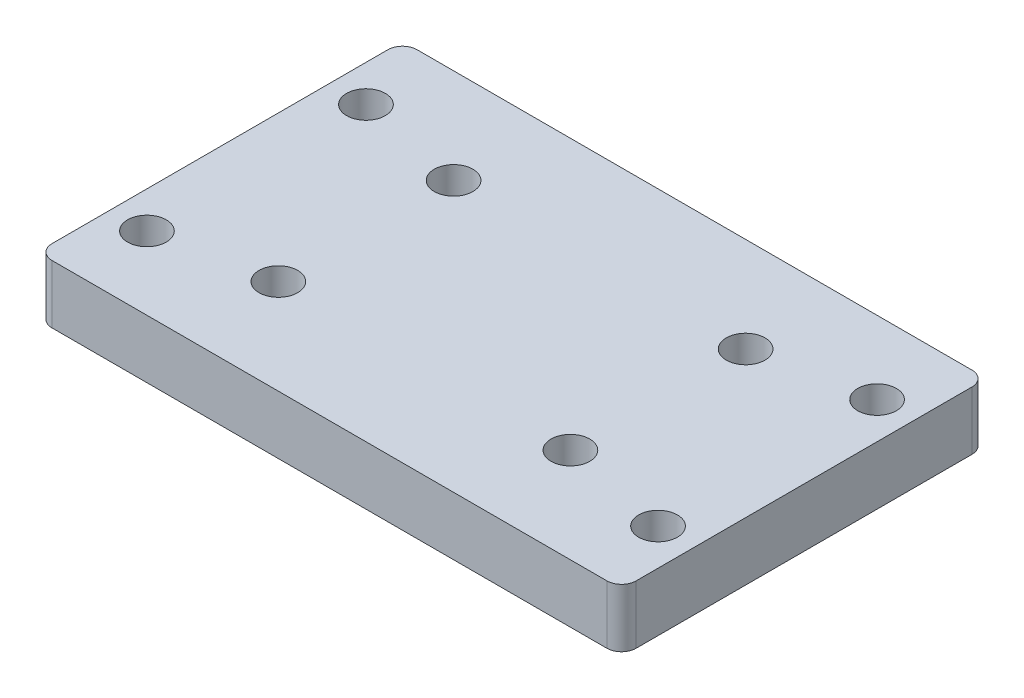
ISO-10303-21;
HEADER;
FILE_DESCRIPTION(('STEP AP214'),'2;1');
FILE_NAME('part.step','',(''),(''),'','','');
FILE_SCHEMA(('AUTOMOTIVE_DESIGN { 1 0 10303 214 1 1 1 1 }'));
ENDSEC;
DATA;
#1=APPLICATION_CONTEXT('core data for automotive mechanical design processes');
#2=APPLICATION_PROTOCOL_DEFINITION('international standard','automotive_design',2000,#1);
#3=PRODUCT_CONTEXT('',#1,'mechanical');
#4=PRODUCT('Part','Part','',(#3));
#5=PRODUCT_RELATED_PRODUCT_CATEGORY('part','',(#4));
#6=PRODUCT_DEFINITION_FORMATION('','',#4);
#7=PRODUCT_DEFINITION_CONTEXT('part definition',#1,'design');
#8=PRODUCT_DEFINITION('design','',#6,#7);
#9=PRODUCT_DEFINITION_SHAPE('','',#8);
#10=(LENGTH_UNIT() NAMED_UNIT(*) SI_UNIT(.MILLI.,.METRE.));
#11=(NAMED_UNIT(*) PLANE_ANGLE_UNIT() SI_UNIT($,.RADIAN.));
#12=(NAMED_UNIT(*) SI_UNIT($,.STERADIAN.) SOLID_ANGLE_UNIT());
#13=UNCERTAINTY_MEASURE_WITH_UNIT(LENGTH_MEASURE(1.E-05),#10,'distance_accuracy_value','');
#14=(GEOMETRIC_REPRESENTATION_CONTEXT(3) GLOBAL_UNCERTAINTY_ASSIGNED_CONTEXT((#13)) GLOBAL_UNIT_ASSIGNED_CONTEXT((#10,
#11,#12)) REPRESENTATION_CONTEXT('',''));
#15=CARTESIAN_POINT('',(0.,0.,0.));
#16=DIRECTION('',(0.,0.,1.));
#17=DIRECTION('',(1.,0.,0.));
#18=AXIS2_PLACEMENT_3D('',#15,#16,#17);
#19=CARTESIAN_POINT('',(-40.,8.,25.));
#20=DIRECTION('',(1.,0.,0.));
#21=DIRECTION('',(0.,0.,-1.));
#22=AXIS2_PLACEMENT_3D('',#19,#20,#21);
#23=PLANE('',#22);
#24=DIRECTION('',(0.,0.,1.));
#25=VECTOR('',#24,1.);
#26=CARTESIAN_POINT('',(-40.,8.,25.));
#27=LINE('',#26,#25);
#28=CARTESIAN_POINT('',(-40.,8.,-23.));
#29=VERTEX_POINT('',#28);
#30=CARTESIAN_POINT('',(-40.,8.,23.));
#31=VERTEX_POINT('',#30);
#32=EDGE_CURVE('E130',#29,#31,#27,.T.);
#33=ORIENTED_EDGE('',*,*,#32,.F.);
#34=DIRECTION('',(0.,-1.,0.));
#35=VECTOR('',#34,1.);
#36=CARTESIAN_POINT('',(-40.,8.,-23.));
#37=LINE('',#36,#35);
#38=CARTESIAN_POINT('',(-40.,0.,-23.));
#39=VERTEX_POINT('',#38);
#40=EDGE_CURVE('E11',#29,#39,#37,.T.);
#41=ORIENTED_EDGE('',*,*,#40,.T.);
#42=DIRECTION('',(0.,0.,1.));
#43=VECTOR('',#42,1.);
#44=CARTESIAN_POINT('',(-40.,0.,25.));
#45=LINE('',#44,#43);
#46=CARTESIAN_POINT('',(-40.,0.,23.));
#47=VERTEX_POINT('',#46);
#48=EDGE_CURVE('E132',#39,#47,#45,.T.);
#49=ORIENTED_EDGE('',*,*,#48,.T.);
#50=DIRECTION('',(0.,-1.,0.));
#51=VECTOR('',#50,1.);
#52=CARTESIAN_POINT('',(-40.,8.,23.));
#53=LINE('',#52,#51);
#54=EDGE_CURVE('E43',#47,#31,#53,.F.);
#55=ORIENTED_EDGE('',*,*,#54,.T.);
#56=EDGE_LOOP('',(#33,#41,#49,#55));
#57=FACE_BOUND('',#56,.T.);
#58=ADVANCED_FACE('F35',(#57),#23,.F.);
#59=CARTESIAN_POINT('',(40.,8.,25.));
#60=DIRECTION('',(0.,0.,-1.));
#61=DIRECTION('',(-1.,0.,0.));
#62=AXIS2_PLACEMENT_3D('',#59,#60,#61);
#63=PLANE('',#62);
#64=DIRECTION('',(1.,0.,0.));
#65=VECTOR('',#64,1.);
#66=CARTESIAN_POINT('',(40.,0.,25.));
#67=LINE('',#66,#65);
#68=CARTESIAN_POINT('',(-38.,0.,25.));
#69=VERTEX_POINT('',#68);
#70=CARTESIAN_POINT('',(38.,0.,25.));
#71=VERTEX_POINT('',#70);
#72=EDGE_CURVE('E128',#69,#71,#67,.T.);
#73=ORIENTED_EDGE('',*,*,#72,.T.);
#74=DIRECTION('',(0.,-1.,0.));
#75=VECTOR('',#74,1.);
#76=CARTESIAN_POINT('',(38.,8.,25.));
#77=LINE('',#76,#75);
#78=CARTESIAN_POINT('',(38.,8.,25.));
#79=VERTEX_POINT('',#78);
#80=EDGE_CURVE('E107',#71,#79,#77,.F.);
#81=ORIENTED_EDGE('',*,*,#80,.T.);
#82=DIRECTION('',(1.,0.,0.));
#83=VECTOR('',#82,1.);
#84=CARTESIAN_POINT('',(40.,8.,25.));
#85=LINE('',#84,#83);
#86=CARTESIAN_POINT('',(-38.,8.,25.));
#87=VERTEX_POINT('',#86);
#88=EDGE_CURVE('E168',#87,#79,#85,.T.);
#89=ORIENTED_EDGE('',*,*,#88,.F.);
#90=DIRECTION('',(0.,-1.,0.));
#91=VECTOR('',#90,1.);
#92=CARTESIAN_POINT('',(-38.,8.,25.));
#93=LINE('',#92,#91);
#94=EDGE_CURVE('E112',#87,#69,#93,.T.);
#95=ORIENTED_EDGE('',*,*,#94,.T.);
#96=EDGE_LOOP('',(#73,#81,#89,#95));
#97=FACE_BOUND('',#96,.T.);
#98=ADVANCED_FACE('F172',(#97),#63,.F.);
#99=CARTESIAN_POINT('',(40.,8.,25.));
#100=DIRECTION('',(-1.,0.,0.));
#101=DIRECTION('',(0.,0.,1.));
#102=AXIS2_PLACEMENT_3D('',#99,#100,#101);
#103=PLANE('',#102);
#104=DIRECTION('',(0.,0.,-1.));
#105=VECTOR('',#104,1.);
#106=CARTESIAN_POINT('',(40.,8.,25.));
#107=LINE('',#106,#105);
#108=CARTESIAN_POINT('',(40.,8.,23.));
#109=VERTEX_POINT('',#108);
#110=CARTESIAN_POINT('',(40.,8.,-23.));
#111=VERTEX_POINT('',#110);
#112=EDGE_CURVE('E121',#109,#111,#107,.T.);
#113=ORIENTED_EDGE('',*,*,#112,.F.);
#114=DIRECTION('',(0.,-1.,0.));
#115=VECTOR('',#114,1.);
#116=CARTESIAN_POINT('',(40.,8.,23.));
#117=LINE('',#116,#115);
#118=CARTESIAN_POINT('',(40.,0.,23.));
#119=VERTEX_POINT('',#118);
#120=EDGE_CURVE('E106',#109,#119,#117,.T.);
#121=ORIENTED_EDGE('',*,*,#120,.T.);
#122=DIRECTION('',(0.,0.,-1.));
#123=VECTOR('',#122,1.);
#124=CARTESIAN_POINT('',(40.,0.,25.));
#125=LINE('',#124,#123);
#126=CARTESIAN_POINT('',(40.,0.,-23.));
#127=VERTEX_POINT('',#126);
#128=EDGE_CURVE('E119',#119,#127,#125,.T.);
#129=ORIENTED_EDGE('',*,*,#128,.T.);
#130=DIRECTION('',(0.,-1.,0.));
#131=VECTOR('',#130,1.);
#132=CARTESIAN_POINT('',(40.,8.,-23.));
#133=LINE('',#132,#131);
#134=EDGE_CURVE('E123',#127,#111,#133,.F.);
#135=ORIENTED_EDGE('',*,*,#134,.T.);
#136=EDGE_LOOP('',(#113,#121,#129,#135));
#137=FACE_BOUND('',#136,.T.);
#138=ADVANCED_FACE('F118',(#137),#103,.F.);
#139=CARTESIAN_POINT('',(40.,8.,-25.));
#140=DIRECTION('',(0.,0.,1.));
#141=DIRECTION('',(1.,0.,0.));
#142=AXIS2_PLACEMENT_3D('',#139,#140,#141);
#143=PLANE('',#142);
#144=DIRECTION('',(-1.,0.,0.));
#145=VECTOR('',#144,1.);
#146=CARTESIAN_POINT('',(40.,8.,-25.));
#147=LINE('',#146,#145);
#148=CARTESIAN_POINT('',(38.,8.,-25.));
#149=VERTEX_POINT('',#148);
#150=CARTESIAN_POINT('',(-38.,8.,-25.));
#151=VERTEX_POINT('',#150);
#152=EDGE_CURVE('E136',#149,#151,#147,.T.);
#153=ORIENTED_EDGE('',*,*,#152,.F.);
#154=DIRECTION('',(0.,-1.,0.));
#155=VECTOR('',#154,1.);
#156=CARTESIAN_POINT('',(38.,8.,-25.));
#157=LINE('',#156,#155);
#158=CARTESIAN_POINT('',(38.,0.,-25.));
#159=VERTEX_POINT('',#158);
#160=EDGE_CURVE('E153',#149,#159,#157,.T.);
#161=ORIENTED_EDGE('',*,*,#160,.T.);
#162=DIRECTION('',(-1.,0.,0.));
#163=VECTOR('',#162,1.);
#164=CARTESIAN_POINT('',(40.,0.,-25.));
#165=LINE('',#164,#163);
#166=CARTESIAN_POINT('',(-38.,0.,-25.));
#167=VERTEX_POINT('',#166);
#168=EDGE_CURVE('E127',#159,#167,#165,.T.);
#169=ORIENTED_EDGE('',*,*,#168,.T.);
#170=DIRECTION('',(0.,-1.,0.));
#171=VECTOR('',#170,1.);
#172=CARTESIAN_POINT('',(-38.,8.,-25.));
#173=LINE('',#172,#171);
#174=EDGE_CURVE('E50',#167,#151,#173,.F.);
#175=ORIENTED_EDGE('',*,*,#174,.T.);
#176=EDGE_LOOP('',(#153,#161,#169,#175));
#177=FACE_BOUND('',#176,.T.);
#178=ADVANCED_FACE('F230',(#177),#143,.F.);
#179=CARTESIAN_POINT('',(0.,8.,0.));
#180=DIRECTION('',(0.,1.,0.));
#181=DIRECTION('',(0.,0.,1.));
#182=AXIS2_PLACEMENT_3D('',#179,#180,#181);
#183=PLANE('',#182);
#184=CARTESIAN_POINT('',(-35.,8.,-15.));
#185=DIRECTION('',(0.,1.,0.));
#186=DIRECTION('',(0.,0.,1.));
#187=AXIS2_PLACEMENT_3D('',#184,#185,#186);
#188=CIRCLE('',#187,2.64999999999999);
#189=CARTESIAN_POINT('',(-35.,8.,-12.35));
#190=VERTEX_POINT('',#189);
#191=EDGE_CURVE('E222',#190,#190,#188,.T.);
#192=ORIENTED_EDGE('',*,*,#191,.F.);
#193=EDGE_LOOP('',(#192));
#194=FACE_BOUND('',#193,.T.);
#195=CARTESIAN_POINT('',(-20.,8.,-12.));
#196=DIRECTION('',(0.,1.,0.));
#197=DIRECTION('',(0.,0.,1.));
#198=AXIS2_PLACEMENT_3D('',#195,#196,#197);
#199=CIRCLE('',#198,2.64999999999999);
#200=CARTESIAN_POINT('',(-20.,8.,-9.35000000000001));
#201=VERTEX_POINT('',#200);
#202=EDGE_CURVE('E216',#201,#201,#199,.T.);
#203=ORIENTED_EDGE('',*,*,#202,.F.);
#204=EDGE_LOOP('',(#203));
#205=FACE_BOUND('',#204,.T.);
#206=CARTESIAN_POINT('',(-20.,8.,12.));
#207=DIRECTION('',(0.,1.,0.));
#208=DIRECTION('',(0.,0.,1.));
#209=AXIS2_PLACEMENT_3D('',#206,#207,#208);
#210=CIRCLE('',#209,2.64999999999999);
#211=CARTESIAN_POINT('',(-20.,8.,14.65));
#212=VERTEX_POINT('',#211);
#213=EDGE_CURVE('E210',#212,#212,#210,.T.);
#214=ORIENTED_EDGE('',*,*,#213,.F.);
#215=EDGE_LOOP('',(#214));
#216=FACE_BOUND('',#215,.T.);
#217=CARTESIAN_POINT('',(-35.,8.,15.));
#218=DIRECTION('',(0.,1.,0.));
#219=DIRECTION('',(0.,0.,1.));
#220=AXIS2_PLACEMENT_3D('',#217,#218,#219);
#221=CIRCLE('',#220,2.64999999999999);
#222=CARTESIAN_POINT('',(-35.,8.,17.65));
#223=VERTEX_POINT('',#222);
#224=EDGE_CURVE('E204',#223,#223,#221,.T.);
#225=ORIENTED_EDGE('',*,*,#224,.F.);
#226=EDGE_LOOP('',(#225));
#227=FACE_BOUND('',#226,.T.);
#228=CARTESIAN_POINT('',(35.,8.,15.));
#229=DIRECTION('',(0.,1.,0.));
#230=DIRECTION('',(0.,0.,1.));
#231=AXIS2_PLACEMENT_3D('',#228,#229,#230);
#232=CIRCLE('',#231,2.64999999999999);
#233=CARTESIAN_POINT('',(35.,8.,17.65));
#234=VERTEX_POINT('',#233);
#235=EDGE_CURVE('E198',#234,#234,#232,.T.);
#236=ORIENTED_EDGE('',*,*,#235,.F.);
#237=EDGE_LOOP('',(#236));
#238=FACE_BOUND('',#237,.T.);
#239=CARTESIAN_POINT('',(20.,8.,12.));
#240=DIRECTION('',(0.,1.,0.));
#241=DIRECTION('',(0.,0.,1.));
#242=AXIS2_PLACEMENT_3D('',#239,#240,#241);
#243=CIRCLE('',#242,2.64999999999999);
#244=CARTESIAN_POINT('',(20.,8.,14.65));
#245=VERTEX_POINT('',#244);
#246=EDGE_CURVE('E192',#245,#245,#243,.T.);
#247=ORIENTED_EDGE('',*,*,#246,.F.);
#248=EDGE_LOOP('',(#247));
#249=FACE_BOUND('',#248,.T.);
#250=CARTESIAN_POINT('',(20.,8.,-12.));
#251=DIRECTION('',(0.,1.,0.));
#252=DIRECTION('',(0.,0.,1.));
#253=AXIS2_PLACEMENT_3D('',#250,#251,#252);
#254=CIRCLE('',#253,2.64999999999999);
#255=CARTESIAN_POINT('',(20.,8.,-9.35000000000001));
#256=VERTEX_POINT('',#255);
#257=EDGE_CURVE('E186',#256,#256,#254,.T.);
#258=ORIENTED_EDGE('',*,*,#257,.F.);
#259=EDGE_LOOP('',(#258));
#260=FACE_BOUND('',#259,.T.);
#261=CARTESIAN_POINT('',(35.,8.,-15.));
#262=DIRECTION('',(0.,1.,0.));
#263=DIRECTION('',(0.,0.,1.));
#264=AXIS2_PLACEMENT_3D('',#261,#262,#263);
#265=CIRCLE('',#264,2.64999999999999);
#266=CARTESIAN_POINT('',(35.,8.,-12.35));
#267=VERTEX_POINT('',#266);
#268=EDGE_CURVE('E175',#267,#267,#265,.T.);
#269=ORIENTED_EDGE('',*,*,#268,.F.);
#270=EDGE_LOOP('',(#269));
#271=FACE_BOUND('',#270,.T.);
#272=ORIENTED_EDGE('',*,*,#88,.T.);
#273=CARTESIAN_POINT('',(38.,8.,23.));
#274=DIRECTION('',(0.,1.,0.));
#275=DIRECTION('',(0.,0.,1.));
#276=AXIS2_PLACEMENT_3D('',#273,#274,#275);
#277=CIRCLE('',#276,2.);
#278=EDGE_CURVE('E150',#79,#109,#277,.T.);
#279=ORIENTED_EDGE('',*,*,#278,.T.);
#280=ORIENTED_EDGE('',*,*,#112,.T.);
#281=CARTESIAN_POINT('',(38.,8.,-23.));
#282=DIRECTION('',(0.,1.,0.));
#283=DIRECTION('',(0.,0.,1.));
#284=AXIS2_PLACEMENT_3D('',#281,#282,#283);
#285=CIRCLE('',#284,2.);
#286=EDGE_CURVE('E57',#111,#149,#285,.T.);
#287=ORIENTED_EDGE('',*,*,#286,.T.);
#288=ORIENTED_EDGE('',*,*,#152,.T.);
#289=CARTESIAN_POINT('',(-38.,8.,-23.));
#290=DIRECTION('',(0.,1.,0.));
#291=DIRECTION('',(0.,0.,1.));
#292=AXIS2_PLACEMENT_3D('',#289,#290,#291);
#293=CIRCLE('',#292,2.);
#294=EDGE_CURVE('E147',#151,#29,#293,.T.);
#295=ORIENTED_EDGE('',*,*,#294,.T.);
#296=ORIENTED_EDGE('',*,*,#32,.T.);
#297=CARTESIAN_POINT('',(-38.,8.,23.));
#298=DIRECTION('',(0.,1.,0.));
#299=DIRECTION('',(0.,0.,1.));
#300=AXIS2_PLACEMENT_3D('',#297,#298,#299);
#301=CIRCLE('',#300,2.);
#302=EDGE_CURVE('E145',#31,#87,#301,.T.);
#303=ORIENTED_EDGE('',*,*,#302,.T.);
#304=EDGE_LOOP('',(#272,#279,#280,#287,#288,#295,#296,#303));
#305=FACE_BOUND('',#304,.T.);
#306=ADVANCED_FACE('F165',(#194,#205,#216,#227,#238,#249,#260,#271,#305),#183,.T.);
#307=CARTESIAN_POINT('',(0.,0.,0.));
#308=DIRECTION('',(0.,1.,0.));
#309=DIRECTION('',(0.,0.,1.));
#310=AXIS2_PLACEMENT_3D('',#307,#308,#309);
#311=PLANE('',#310);
#312=CARTESIAN_POINT('',(-35.,0.,-15.));
#313=DIRECTION('',(0.,1.,0.));
#314=DIRECTION('',(0.,0.,1.));
#315=AXIS2_PLACEMENT_3D('',#312,#313,#314);
#316=CIRCLE('',#315,2.64999999999999);
#317=CARTESIAN_POINT('',(-35.,0.,-12.35));
#318=VERTEX_POINT('',#317);
#319=EDGE_CURVE('E219',#318,#318,#316,.T.);
#320=ORIENTED_EDGE('',*,*,#319,.T.);
#321=EDGE_LOOP('',(#320));
#322=FACE_BOUND('',#321,.T.);
#323=CARTESIAN_POINT('',(-20.,0.,-12.));
#324=DIRECTION('',(0.,1.,0.));
#325=DIRECTION('',(0.,0.,1.));
#326=AXIS2_PLACEMENT_3D('',#323,#324,#325);
#327=CIRCLE('',#326,2.64999999999999);
#328=CARTESIAN_POINT('',(-20.,0.,-9.35000000000001));
#329=VERTEX_POINT('',#328);
#330=EDGE_CURVE('E213',#329,#329,#327,.T.);
#331=ORIENTED_EDGE('',*,*,#330,.T.);
#332=EDGE_LOOP('',(#331));
#333=FACE_BOUND('',#332,.T.);
#334=CARTESIAN_POINT('',(-20.,0.,12.));
#335=DIRECTION('',(0.,1.,0.));
#336=DIRECTION('',(0.,0.,1.));
#337=AXIS2_PLACEMENT_3D('',#334,#335,#336);
#338=CIRCLE('',#337,2.64999999999999);
#339=CARTESIAN_POINT('',(-20.,0.,14.65));
#340=VERTEX_POINT('',#339);
#341=EDGE_CURVE('E207',#340,#340,#338,.T.);
#342=ORIENTED_EDGE('',*,*,#341,.T.);
#343=EDGE_LOOP('',(#342));
#344=FACE_BOUND('',#343,.T.);
#345=CARTESIAN_POINT('',(-35.,0.,15.));
#346=DIRECTION('',(0.,1.,0.));
#347=DIRECTION('',(0.,0.,1.));
#348=AXIS2_PLACEMENT_3D('',#345,#346,#347);
#349=CIRCLE('',#348,2.64999999999999);
#350=CARTESIAN_POINT('',(-35.,0.,17.65));
#351=VERTEX_POINT('',#350);
#352=EDGE_CURVE('E201',#351,#351,#349,.T.);
#353=ORIENTED_EDGE('',*,*,#352,.T.);
#354=EDGE_LOOP('',(#353));
#355=FACE_BOUND('',#354,.T.);
#356=CARTESIAN_POINT('',(35.,0.,15.));
#357=DIRECTION('',(0.,1.,0.));
#358=DIRECTION('',(0.,0.,1.));
#359=AXIS2_PLACEMENT_3D('',#356,#357,#358);
#360=CIRCLE('',#359,2.64999999999999);
#361=CARTESIAN_POINT('',(35.,0.,17.65));
#362=VERTEX_POINT('',#361);
#363=EDGE_CURVE('E195',#362,#362,#360,.T.);
#364=ORIENTED_EDGE('',*,*,#363,.T.);
#365=EDGE_LOOP('',(#364));
#366=FACE_BOUND('',#365,.T.);
#367=CARTESIAN_POINT('',(20.,0.,12.));
#368=DIRECTION('',(0.,1.,0.));
#369=DIRECTION('',(0.,0.,1.));
#370=AXIS2_PLACEMENT_3D('',#367,#368,#369);
#371=CIRCLE('',#370,2.64999999999999);
#372=CARTESIAN_POINT('',(20.,0.,14.65));
#373=VERTEX_POINT('',#372);
#374=EDGE_CURVE('E189',#373,#373,#371,.T.);
#375=ORIENTED_EDGE('',*,*,#374,.T.);
#376=EDGE_LOOP('',(#375));
#377=FACE_BOUND('',#376,.T.);
#378=CARTESIAN_POINT('',(20.,0.,-12.));
#379=DIRECTION('',(0.,1.,0.));
#380=DIRECTION('',(0.,0.,1.));
#381=AXIS2_PLACEMENT_3D('',#378,#379,#380);
#382=CIRCLE('',#381,2.64999999999999);
#383=CARTESIAN_POINT('',(20.,0.,-9.35000000000001));
#384=VERTEX_POINT('',#383);
#385=EDGE_CURVE('E183',#384,#384,#382,.T.);
#386=ORIENTED_EDGE('',*,*,#385,.T.);
#387=EDGE_LOOP('',(#386));
#388=FACE_BOUND('',#387,.T.);
#389=CARTESIAN_POINT('',(35.,0.,-15.));
#390=DIRECTION('',(0.,1.,0.));
#391=DIRECTION('',(0.,0.,1.));
#392=AXIS2_PLACEMENT_3D('',#389,#390,#391);
#393=CIRCLE('',#392,2.64999999999999);
#394=CARTESIAN_POINT('',(35.,0.,-12.35));
#395=VERTEX_POINT('',#394);
#396=EDGE_CURVE('E173',#395,#395,#393,.T.);
#397=ORIENTED_EDGE('',*,*,#396,.T.);
#398=EDGE_LOOP('',(#397));
#399=FACE_BOUND('',#398,.T.);
#400=ORIENTED_EDGE('',*,*,#128,.F.);
#401=CARTESIAN_POINT('',(38.,0.,23.));
#402=DIRECTION('',(0.,1.,0.));
#403=DIRECTION('',(0.,0.,1.));
#404=AXIS2_PLACEMENT_3D('',#401,#402,#403);
#405=CIRCLE('',#404,2.);
#406=EDGE_CURVE('E102',#119,#71,#405,.F.);
#407=ORIENTED_EDGE('',*,*,#406,.T.);
#408=ORIENTED_EDGE('',*,*,#72,.F.);
#409=CARTESIAN_POINT('',(-38.,0.,23.));
#410=DIRECTION('',(0.,1.,0.));
#411=DIRECTION('',(0.,0.,1.));
#412=AXIS2_PLACEMENT_3D('',#409,#410,#411);
#413=CIRCLE('',#412,2.);
#414=EDGE_CURVE('E122',#69,#47,#413,.F.);
#415=ORIENTED_EDGE('',*,*,#414,.T.);
#416=ORIENTED_EDGE('',*,*,#48,.F.);
#417=CARTESIAN_POINT('',(-38.,0.,-23.));
#418=DIRECTION('',(0.,1.,0.));
#419=DIRECTION('',(0.,0.,1.));
#420=AXIS2_PLACEMENT_3D('',#417,#418,#419);
#421=CIRCLE('',#420,2.);
#422=EDGE_CURVE('E139',#39,#167,#421,.F.);
#423=ORIENTED_EDGE('',*,*,#422,.T.);
#424=ORIENTED_EDGE('',*,*,#168,.F.);
#425=CARTESIAN_POINT('',(38.,0.,-23.));
#426=DIRECTION('',(0.,1.,0.));
#427=DIRECTION('',(0.,0.,1.));
#428=AXIS2_PLACEMENT_3D('',#425,#426,#427);
#429=CIRCLE('',#428,2.);
#430=EDGE_CURVE('E113',#159,#127,#429,.F.);
#431=ORIENTED_EDGE('',*,*,#430,.T.);
#432=EDGE_LOOP('',(#400,#407,#408,#415,#416,#423,#424,#431));
#433=FACE_BOUND('',#432,.T.);
#434=ADVANCED_FACE('F125',(#322,#333,#344,#355,#366,#377,#388,#399,#433),#311,.F.);
#435=CARTESIAN_POINT('',(38.,8.,23.));
#436=DIRECTION('',(0.,-1.,0.));
#437=DIRECTION('',(0.,0.,-1.));
#438=AXIS2_PLACEMENT_3D('',#435,#436,#437);
#439=CYLINDRICAL_SURFACE('',#438,2.);
#440=ORIENTED_EDGE('',*,*,#278,.F.);
#441=ORIENTED_EDGE('',*,*,#80,.F.);
#442=ORIENTED_EDGE('',*,*,#406,.F.);
#443=ORIENTED_EDGE('',*,*,#120,.F.);
#444=EDGE_LOOP('',(#440,#441,#442,#443));
#445=FACE_BOUND('',#444,.T.);
#446=ADVANCED_FACE('F105',(#445),#439,.T.);
#447=CARTESIAN_POINT('',(38.,8.,-23.));
#448=DIRECTION('',(0.,-1.,0.));
#449=DIRECTION('',(0.,0.,-1.));
#450=AXIS2_PLACEMENT_3D('',#447,#448,#449);
#451=CYLINDRICAL_SURFACE('',#450,2.);
#452=ORIENTED_EDGE('',*,*,#286,.F.);
#453=ORIENTED_EDGE('',*,*,#134,.F.);
#454=ORIENTED_EDGE('',*,*,#430,.F.);
#455=ORIENTED_EDGE('',*,*,#160,.F.);
#456=EDGE_LOOP('',(#452,#453,#454,#455));
#457=FACE_BOUND('',#456,.T.);
#458=ADVANCED_FACE('F270',(#457),#451,.T.);
#459=CARTESIAN_POINT('',(-38.,8.,-23.));
#460=DIRECTION('',(0.,-1.,0.));
#461=DIRECTION('',(0.,0.,-1.));
#462=AXIS2_PLACEMENT_3D('',#459,#460,#461);
#463=CYLINDRICAL_SURFACE('',#462,2.);
#464=ORIENTED_EDGE('',*,*,#294,.F.);
#465=ORIENTED_EDGE('',*,*,#174,.F.);
#466=ORIENTED_EDGE('',*,*,#422,.F.);
#467=ORIENTED_EDGE('',*,*,#40,.F.);
#468=EDGE_LOOP('',(#464,#465,#466,#467));
#469=FACE_BOUND('',#468,.T.);
#470=ADVANCED_FACE('F258',(#469),#463,.T.);
#471=CARTESIAN_POINT('',(-38.,8.,23.));
#472=DIRECTION('',(0.,-1.,0.));
#473=DIRECTION('',(0.,0.,-1.));
#474=AXIS2_PLACEMENT_3D('',#471,#472,#473);
#475=CYLINDRICAL_SURFACE('',#474,2.);
#476=ORIENTED_EDGE('',*,*,#302,.F.);
#477=ORIENTED_EDGE('',*,*,#54,.F.);
#478=ORIENTED_EDGE('',*,*,#414,.F.);
#479=ORIENTED_EDGE('',*,*,#94,.F.);
#480=EDGE_LOOP('',(#476,#477,#478,#479));
#481=FACE_BOUND('',#480,.T.);
#482=ADVANCED_FACE('F37',(#481),#475,.T.);
#483=CARTESIAN_POINT('',(35.,8.,-15.));
#484=DIRECTION('',(0.,1.,0.));
#485=DIRECTION('',(0.,0.,1.));
#486=AXIS2_PLACEMENT_3D('',#483,#484,#485);
#487=CYLINDRICAL_SURFACE('',#486,2.64999999999999);
#488=ORIENTED_EDGE('',*,*,#396,.F.);
#489=EDGE_LOOP('',(#488));
#490=FACE_BOUND('',#489,.T.);
#491=ORIENTED_EDGE('',*,*,#268,.T.);
#492=EDGE_LOOP('',(#491));
#493=FACE_BOUND('',#492,.T.);
#494=ADVANCED_FACE('F246',(#490,#493),#487,.F.);
#495=CARTESIAN_POINT('',(20.,8.,-12.));
#496=DIRECTION('',(0.,1.,0.));
#497=DIRECTION('',(0.,0.,1.));
#498=AXIS2_PLACEMENT_3D('',#495,#496,#497);
#499=CYLINDRICAL_SURFACE('',#498,2.64999999999999);
#500=ORIENTED_EDGE('',*,*,#385,.F.);
#501=EDGE_LOOP('',(#500));
#502=FACE_BOUND('',#501,.T.);
#503=ORIENTED_EDGE('',*,*,#257,.T.);
#504=EDGE_LOOP('',(#503));
#505=FACE_BOUND('',#504,.T.);
#506=ADVANCED_FACE('F248',(#502,#505),#499,.F.);
#507=CARTESIAN_POINT('',(20.,8.,12.));
#508=DIRECTION('',(0.,1.,0.));
#509=DIRECTION('',(0.,0.,1.));
#510=AXIS2_PLACEMENT_3D('',#507,#508,#509);
#511=CYLINDRICAL_SURFACE('',#510,2.64999999999999);
#512=ORIENTED_EDGE('',*,*,#374,.F.);
#513=EDGE_LOOP('',(#512));
#514=FACE_BOUND('',#513,.T.);
#515=ORIENTED_EDGE('',*,*,#246,.T.);
#516=EDGE_LOOP('',(#515));
#517=FACE_BOUND('',#516,.T.);
#518=ADVANCED_FACE('F255',(#514,#517),#511,.F.);
#519=CARTESIAN_POINT('',(35.,8.,15.));
#520=DIRECTION('',(0.,1.,0.));
#521=DIRECTION('',(0.,0.,1.));
#522=AXIS2_PLACEMENT_3D('',#519,#520,#521);
#523=CYLINDRICAL_SURFACE('',#522,2.64999999999999);
#524=ORIENTED_EDGE('',*,*,#363,.F.);
#525=EDGE_LOOP('',(#524));
#526=FACE_BOUND('',#525,.T.);
#527=ORIENTED_EDGE('',*,*,#235,.T.);
#528=EDGE_LOOP('',(#527));
#529=FACE_BOUND('',#528,.T.);
#530=ADVANCED_FACE('F320',(#526,#529),#523,.F.);
#531=CARTESIAN_POINT('',(-35.,8.,15.));
#532=DIRECTION('',(0.,1.,0.));
#533=DIRECTION('',(0.,0.,1.));
#534=AXIS2_PLACEMENT_3D('',#531,#532,#533);
#535=CYLINDRICAL_SURFACE('',#534,2.64999999999999);
#536=ORIENTED_EDGE('',*,*,#352,.F.);
#537=EDGE_LOOP('',(#536));
#538=FACE_BOUND('',#537,.T.);
#539=ORIENTED_EDGE('',*,*,#224,.T.);
#540=EDGE_LOOP('',(#539));
#541=FACE_BOUND('',#540,.T.);
#542=ADVANCED_FACE('F330',(#538,#541),#535,.F.);
#543=CARTESIAN_POINT('',(-20.,8.,12.));
#544=DIRECTION('',(0.,1.,0.));
#545=DIRECTION('',(0.,0.,1.));
#546=AXIS2_PLACEMENT_3D('',#543,#544,#545);
#547=CYLINDRICAL_SURFACE('',#546,2.64999999999999);
#548=ORIENTED_EDGE('',*,*,#341,.F.);
#549=EDGE_LOOP('',(#548));
#550=FACE_BOUND('',#549,.T.);
#551=ORIENTED_EDGE('',*,*,#213,.T.);
#552=EDGE_LOOP('',(#551));
#553=FACE_BOUND('',#552,.T.);
#554=ADVANCED_FACE('F340',(#550,#553),#547,.F.);
#555=CARTESIAN_POINT('',(-20.,8.,-12.));
#556=DIRECTION('',(0.,1.,0.));
#557=DIRECTION('',(0.,0.,1.));
#558=AXIS2_PLACEMENT_3D('',#555,#556,#557);
#559=CYLINDRICAL_SURFACE('',#558,2.64999999999999);
#560=ORIENTED_EDGE('',*,*,#330,.F.);
#561=EDGE_LOOP('',(#560));
#562=FACE_BOUND('',#561,.T.);
#563=ORIENTED_EDGE('',*,*,#202,.T.);
#564=EDGE_LOOP('',(#563));
#565=FACE_BOUND('',#564,.T.);
#566=ADVANCED_FACE('F350',(#562,#565),#559,.F.);
#567=CARTESIAN_POINT('',(-35.,8.,-15.));
#568=DIRECTION('',(0.,1.,0.));
#569=DIRECTION('',(0.,0.,1.));
#570=AXIS2_PLACEMENT_3D('',#567,#568,#569);
#571=CYLINDRICAL_SURFACE('',#570,2.64999999999999);
#572=ORIENTED_EDGE('',*,*,#319,.F.);
#573=EDGE_LOOP('',(#572));
#574=FACE_BOUND('',#573,.T.);
#575=ORIENTED_EDGE('',*,*,#191,.T.);
#576=EDGE_LOOP('',(#575));
#577=FACE_BOUND('',#576,.T.);
#578=ADVANCED_FACE('F226',(#574,#577),#571,.F.);
#579=CLOSED_SHELL('',(#58,#98,#138,#178,#306,#434,#446,#458,#470,#482,#494,#506,#518,#530,#542,
#554,#566,#578));
#580=MANIFOLD_SOLID_BREP('B2',#579);
#581=ADVANCED_BREP_SHAPE_REPRESENTATION('',(#18,#580),#14);
#582=SHAPE_DEFINITION_REPRESENTATION(#9,#581);
ENDSEC;
END-ISO-10303-21;
